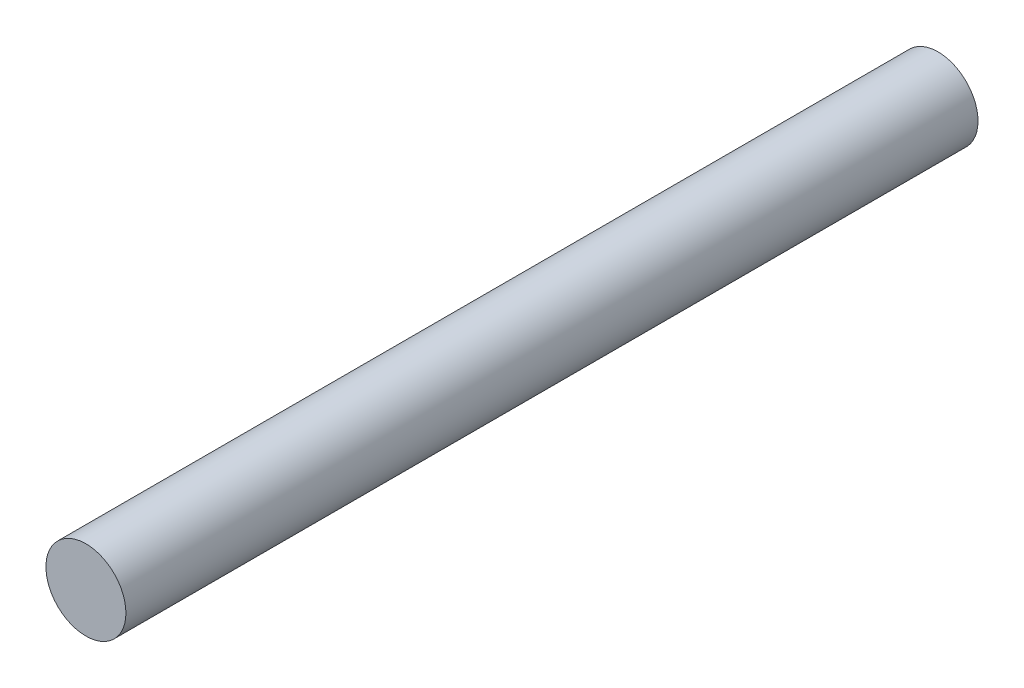
ISO-10303-21;
HEADER;
FILE_DESCRIPTION(('STEP AP214'),'2;1');
FILE_NAME('part.step','',(''),(''),'','','');
FILE_SCHEMA(('AUTOMOTIVE_DESIGN { 1 0 10303 214 1 1 1 1 }'));
ENDSEC;
DATA;
#1=APPLICATION_CONTEXT('core data for automotive mechanical design processes');
#2=APPLICATION_PROTOCOL_DEFINITION('international standard','automotive_design',2000,#1);
#3=PRODUCT_CONTEXT('',#1,'mechanical');
#4=PRODUCT('Part','Part','',(#3));
#5=PRODUCT_RELATED_PRODUCT_CATEGORY('part','',(#4));
#6=PRODUCT_DEFINITION_FORMATION('','',#4);
#7=PRODUCT_DEFINITION_CONTEXT('part definition',#1,'design');
#8=PRODUCT_DEFINITION('design','',#6,#7);
#9=PRODUCT_DEFINITION_SHAPE('','',#8);
#10=(LENGTH_UNIT() NAMED_UNIT(*) SI_UNIT(.MILLI.,.METRE.));
#11=(NAMED_UNIT(*) PLANE_ANGLE_UNIT() SI_UNIT($,.RADIAN.));
#12=(NAMED_UNIT(*) SI_UNIT($,.STERADIAN.) SOLID_ANGLE_UNIT());
#13=UNCERTAINTY_MEASURE_WITH_UNIT(LENGTH_MEASURE(1.E-05),#10,'distance_accuracy_value','');
#14=(GEOMETRIC_REPRESENTATION_CONTEXT(3) GLOBAL_UNCERTAINTY_ASSIGNED_CONTEXT((#13)) GLOBAL_UNIT_ASSIGNED_CONTEXT((#10,
#11,#12)) REPRESENTATION_CONTEXT('',''));
#15=CARTESIAN_POINT('',(0.,0.,0.));
#16=DIRECTION('',(0.,0.,1.));
#17=DIRECTION('',(1.,0.,0.));
#18=AXIS2_PLACEMENT_3D('',#15,#16,#17);
#19=CARTESIAN_POINT('',(0.,0.,101.473));
#20=DIRECTION('',(0.,0.,-1.));
#21=DIRECTION('',(-1.,0.,0.));
#22=AXIS2_PLACEMENT_3D('',#19,#20,#21);
#23=CYLINDRICAL_SURFACE('',#22,4.7625);
#24=CARTESIAN_POINT('',(0.,0.,101.473));
#25=DIRECTION('',(0.,0.,1.));
#26=DIRECTION('',(1.,0.,0.));
#27=AXIS2_PLACEMENT_3D('',#24,#25,#26);
#28=CIRCLE('',#27,4.7625);
#29=CARTESIAN_POINT('',(4.7625,0.,101.473));
#30=VERTEX_POINT('',#29);
#31=EDGE_CURVE('E10',#30,#30,#28,.T.);
#32=ORIENTED_EDGE('',*,*,#31,.F.);
#33=EDGE_LOOP('',(#32));
#34=FACE_BOUND('',#33,.T.);
#35=CARTESIAN_POINT('',(0.,0.,0.));
#36=DIRECTION('',(0.,0.,1.));
#37=DIRECTION('',(1.,0.,0.));
#38=AXIS2_PLACEMENT_3D('',#35,#36,#37);
#39=CIRCLE('',#38,4.7625);
#40=CARTESIAN_POINT('',(4.7625,0.,0.));
#41=VERTEX_POINT('',#40);
#42=EDGE_CURVE('E40',#41,#41,#39,.T.);
#43=ORIENTED_EDGE('',*,*,#42,.T.);
#44=EDGE_LOOP('',(#43));
#45=FACE_BOUND('',#44,.T.);
#46=ADVANCED_FACE('F37',(#34,#45),#23,.T.);
#47=CARTESIAN_POINT('',(0.,0.,101.473));
#48=DIRECTION('',(0.,0.,1.));
#49=DIRECTION('',(1.,0.,0.));
#50=AXIS2_PLACEMENT_3D('',#47,#48,#49);
#51=PLANE('',#50);
#52=ORIENTED_EDGE('',*,*,#31,.T.);
#53=EDGE_LOOP('',(#52));
#54=FACE_BOUND('',#53,.T.);
#55=ADVANCED_FACE('F52',(#54),#51,.T.);
#56=CARTESIAN_POINT('',(0.,0.,0.));
#57=DIRECTION('',(0.,0.,1.));
#58=DIRECTION('',(1.,0.,0.));
#59=AXIS2_PLACEMENT_3D('',#56,#57,#58);
#60=PLANE('',#59);
#61=ORIENTED_EDGE('',*,*,#42,.F.);
#62=EDGE_LOOP('',(#61));
#63=FACE_BOUND('',#62,.T.);
#64=ADVANCED_FACE('F50',(#63),#60,.F.);
#65=CLOSED_SHELL('',(#46,#55,#64));
#66=MANIFOLD_SOLID_BREP('B2',#65);
#67=ADVANCED_BREP_SHAPE_REPRESENTATION('',(#18,#66),#14);
#68=SHAPE_DEFINITION_REPRESENTATION(#9,#67);
ENDSEC;
END-ISO-10303-21;
